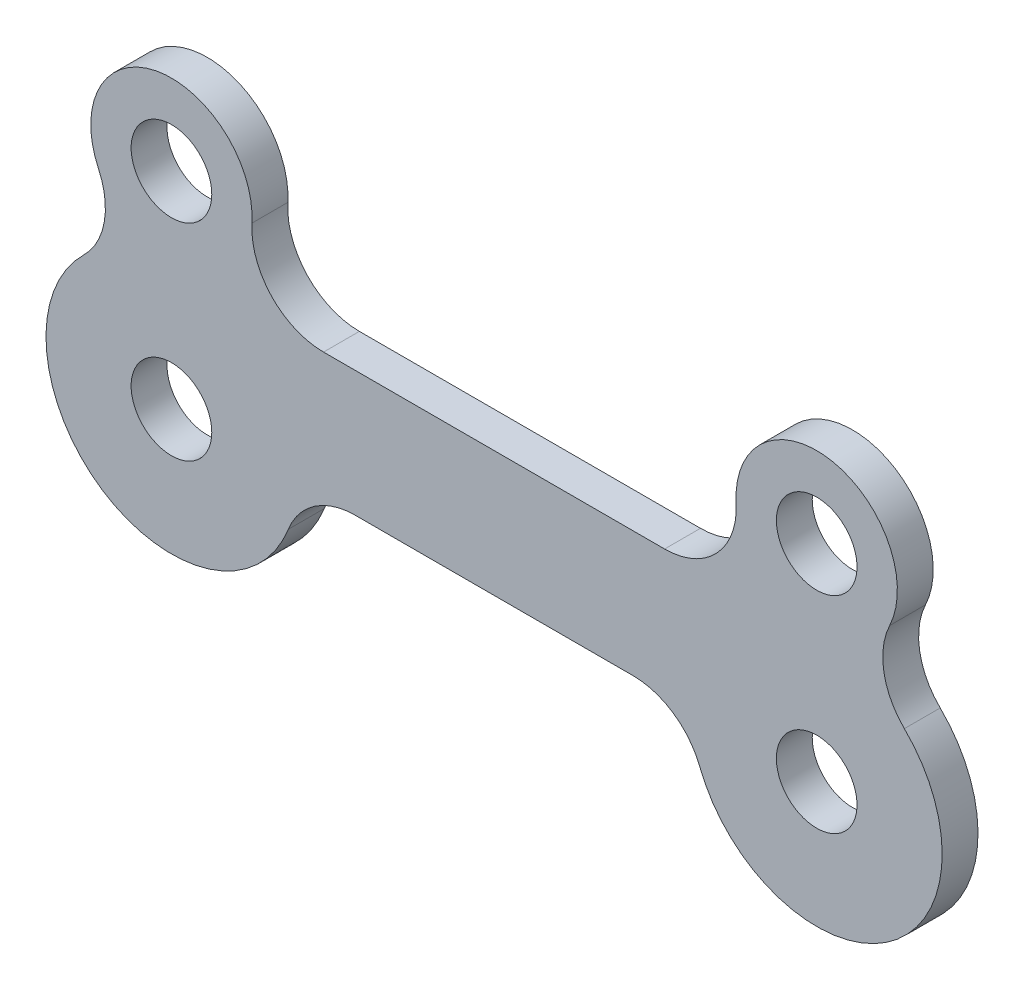
ISO-10303-21;
HEADER;
FILE_DESCRIPTION(('STEP AP214'),'2;1');
FILE_NAME('part.step','',(''),(''),'','','');
FILE_SCHEMA(('AUTOMOTIVE_DESIGN { 1 0 10303 214 1 1 1 1 }'));
ENDSEC;
DATA;
#1=APPLICATION_CONTEXT('core data for automotive mechanical design processes');
#2=APPLICATION_PROTOCOL_DEFINITION('international standard','automotive_design',2000,#1);
#3=PRODUCT_CONTEXT('',#1,'mechanical');
#4=PRODUCT('Part','Part','',(#3));
#5=PRODUCT_RELATED_PRODUCT_CATEGORY('part','',(#4));
#6=PRODUCT_DEFINITION_FORMATION('','',#4);
#7=PRODUCT_DEFINITION_CONTEXT('part definition',#1,'design');
#8=PRODUCT_DEFINITION('design','',#6,#7);
#9=PRODUCT_DEFINITION_SHAPE('','',#8);
#10=(LENGTH_UNIT() NAMED_UNIT(*) SI_UNIT(.MILLI.,.METRE.));
#11=(NAMED_UNIT(*) PLANE_ANGLE_UNIT() SI_UNIT($,.RADIAN.));
#12=(NAMED_UNIT(*) SI_UNIT($,.STERADIAN.) SOLID_ANGLE_UNIT());
#13=UNCERTAINTY_MEASURE_WITH_UNIT(LENGTH_MEASURE(1.E-05),#10,'distance_accuracy_value','');
#14=(GEOMETRIC_REPRESENTATION_CONTEXT(3) GLOBAL_UNCERTAINTY_ASSIGNED_CONTEXT((#13)) GLOBAL_UNIT_ASSIGNED_CONTEXT((#10,
#11,#12)) REPRESENTATION_CONTEXT('',''));
#15=CARTESIAN_POINT('',(0.,0.,0.));
#16=DIRECTION('',(0.,0.,1.));
#17=DIRECTION('',(1.,0.,0.));
#18=AXIS2_PLACEMENT_3D('',#15,#16,#17);
#19=CARTESIAN_POINT('',(-7.55230790919814,8.73125,1.5875));
#20=DIRECTION('',(0.,0.,-1.));
#21=DIRECTION('',(-1.,0.,0.));
#22=AXIS2_PLACEMENT_3D('',#19,#20,#21);
#23=CYLINDRICAL_SURFACE('',#22,3.175);
#24=CARTESIAN_POINT('',(-7.55230790919814,8.73125,0.));
#25=DIRECTION('',(0.,0.,1.));
#26=DIRECTION('',(1.,0.,0.));
#27=AXIS2_PLACEMENT_3D('',#24,#25,#26);
#28=CIRCLE('',#27,3.175);
#29=CARTESIAN_POINT('',(-10.7218100695755,8.91801470588235,0.));
#30=VERTEX_POINT('',#29);
#31=CARTESIAN_POINT('',(-7.55230790919814,5.55625,0.));
#32=VERTEX_POINT('',#31);
#33=EDGE_CURVE('E160',#30,#32,#28,.T.);
#34=ORIENTED_EDGE('',*,*,#33,.F.);
#35=DIRECTION('',(0.,0.,-1.));
#36=VECTOR('',#35,1.);
#37=CARTESIAN_POINT('',(-10.7218100695755,8.91801470588235,1.5875));
#38=LINE('',#37,#36);
#39=CARTESIAN_POINT('',(-10.7218100695755,8.91801470588235,1.5875));
#40=VERTEX_POINT('',#39);
#41=EDGE_CURVE('E228',#40,#30,#38,.T.);
#42=ORIENTED_EDGE('',*,*,#41,.F.);
#43=CARTESIAN_POINT('',(-7.55230790919814,8.73125,1.5875));
#44=DIRECTION('',(0.,0.,1.));
#45=DIRECTION('',(1.,0.,0.));
#46=AXIS2_PLACEMENT_3D('',#43,#44,#45);
#47=CIRCLE('',#46,3.175);
#48=CARTESIAN_POINT('',(-7.55230790919814,5.55625,1.5875));
#49=VERTEX_POINT('',#48);
#50=EDGE_CURVE('E172',#40,#49,#47,.T.);
#51=ORIENTED_EDGE('',*,*,#50,.T.);
#52=DIRECTION('',(0.,0.,-1.));
#53=VECTOR('',#52,1.);
#54=CARTESIAN_POINT('',(-7.55230790919814,5.55625,1.5875));
#55=LINE('',#54,#53);
#56=EDGE_CURVE('E136',#49,#32,#55,.T.);
#57=ORIENTED_EDGE('',*,*,#56,.T.);
#58=EDGE_LOOP('',(#34,#42,#51,#57));
#59=FACE_BOUND('',#58,.T.);
#60=ADVANCED_FACE('F41',(#59),#23,.F.);
#61=CARTESIAN_POINT('',(-14.2875,9.128125,1.5875));
#62=DIRECTION('',(0.,0.,-1.));
#63=DIRECTION('',(-1.,0.,0.));
#64=AXIS2_PLACEMENT_3D('',#61,#62,#63);
#65=CYLINDRICAL_SURFACE('',#64,3.571875);
#66=CARTESIAN_POINT('',(-14.2875,9.128125,0.));
#67=DIRECTION('',(0.,0.,1.));
#68=DIRECTION('',(1.,0.,0.));
#69=AXIS2_PLACEMENT_3D('',#66,#67,#68);
#70=CIRCLE('',#69,3.571875);
#71=CARTESIAN_POINT('',(-17.5171882486604,7.6025415601023,0.));
#72=VERTEX_POINT('',#71);
#73=EDGE_CURVE('E166',#30,#72,#70,.T.);
#74=ORIENTED_EDGE('',*,*,#73,.T.);
#75=DIRECTION('',(0.,0.,-1.));
#76=VECTOR('',#75,1.);
#77=CARTESIAN_POINT('',(-17.5171882486604,7.6025415601023,1.5875));
#78=LINE('',#77,#76);
#79=CARTESIAN_POINT('',(-17.5171882486604,7.6025415601023,1.5875));
#80=VERTEX_POINT('',#79);
#81=EDGE_CURVE('E225',#80,#72,#78,.T.);
#82=ORIENTED_EDGE('',*,*,#81,.F.);
#83=CARTESIAN_POINT('',(-14.2875,9.128125,1.5875));
#84=DIRECTION('',(0.,0.,1.));
#85=DIRECTION('',(1.,0.,0.));
#86=AXIS2_PLACEMENT_3D('',#83,#84,#85);
#87=CIRCLE('',#86,3.571875);
#88=EDGE_CURVE('E175',#40,#80,#87,.T.);
#89=ORIENTED_EDGE('',*,*,#88,.F.);
#90=ORIENTED_EDGE('',*,*,#41,.T.);
#91=EDGE_LOOP('',(#74,#82,#89,#90));
#92=FACE_BOUND('',#91,.T.);
#93=ADVANCED_FACE('F302',(#92),#65,.T.);
#94=CARTESIAN_POINT('',(-20.3880222474696,6.24646739130435,1.5875));
#95=DIRECTION('',(0.,0.,-1.));
#96=DIRECTION('',(-1.,0.,0.));
#97=AXIS2_PLACEMENT_3D('',#94,#95,#96);
#98=CYLINDRICAL_SURFACE('',#97,3.175);
#99=CARTESIAN_POINT('',(-20.3880222474696,6.24646739130435,0.));
#100=DIRECTION('',(0.,0.,1.));
#101=DIRECTION('',(1.,0.,0.));
#102=AXIS2_PLACEMENT_3D('',#99,#100,#101);
#103=CIRCLE('',#102,3.175);
#104=CARTESIAN_POINT('',(-18.169650521117,3.97502470355731,0.));
#105=VERTEX_POINT('',#104);
#106=EDGE_CURVE('E199',#105,#72,#103,.T.);
#107=ORIENTED_EDGE('',*,*,#106,.F.);
#108=DIRECTION('',(0.,0.,-1.));
#109=VECTOR('',#108,1.);
#110=CARTESIAN_POINT('',(-18.169650521117,3.97502470355731,1.5875));
#111=LINE('',#110,#109);
#112=CARTESIAN_POINT('',(-18.169650521117,3.97502470355731,1.5875));
#113=VERTEX_POINT('',#112);
#114=EDGE_CURVE('E222',#113,#105,#111,.T.);
#115=ORIENTED_EDGE('',*,*,#114,.F.);
#116=CARTESIAN_POINT('',(-20.3880222474696,6.24646739130435,1.5875));
#117=DIRECTION('',(0.,0.,1.));
#118=DIRECTION('',(1.,0.,0.));
#119=AXIS2_PLACEMENT_3D('',#116,#117,#118);
#120=CIRCLE('',#119,3.175);
#121=EDGE_CURVE('E179',#113,#80,#120,.T.);
#122=ORIENTED_EDGE('',*,*,#121,.T.);
#123=ORIENTED_EDGE('',*,*,#81,.T.);
#124=EDGE_LOOP('',(#107,#115,#122,#123));
#125=FACE_BOUND('',#124,.T.);
#126=ADVANCED_FACE('F305',(#125),#98,.F.);
#127=CARTESIAN_POINT('',(-14.2875,0.,1.5875));
#128=DIRECTION('',(0.,0.,-1.));
#129=DIRECTION('',(-1.,0.,0.));
#130=AXIS2_PLACEMENT_3D('',#127,#128,#129);
#131=CYLINDRICAL_SURFACE('',#130,5.55625);
#132=CARTESIAN_POINT('',(-14.2875,0.,0.));
#133=DIRECTION('',(0.,0.,1.));
#134=DIRECTION('',(1.,0.,0.));
#135=AXIS2_PLACEMENT_3D('',#132,#133,#134);
#136=CIRCLE('',#135,5.55625);
#137=CARTESIAN_POINT('',(-9.111625436967,-2.02045454545455,0.));
#138=VERTEX_POINT('',#137);
#139=EDGE_CURVE('E203',#105,#138,#136,.T.);
#140=ORIENTED_EDGE('',*,*,#139,.T.);
#141=DIRECTION('',(0.,0.,-1.));
#142=VECTOR('',#141,1.);
#143=CARTESIAN_POINT('',(-9.111625436967,-2.02045454545455,1.5875));
#144=LINE('',#143,#142);
#145=CARTESIAN_POINT('',(-9.111625436967,-2.02045454545455,1.5875));
#146=VERTEX_POINT('',#145);
#147=EDGE_CURVE('E235',#138,#146,#144,.F.);
#148=ORIENTED_EDGE('',*,*,#147,.T.);
#149=CARTESIAN_POINT('',(-14.2875,0.,1.5875));
#150=DIRECTION('',(0.,0.,1.));
#151=DIRECTION('',(1.,0.,0.));
#152=AXIS2_PLACEMENT_3D('',#149,#150,#151);
#153=CIRCLE('',#152,5.55625);
#154=EDGE_CURVE('E183',#113,#146,#153,.T.);
#155=ORIENTED_EDGE('',*,*,#154,.F.);
#156=ORIENTED_EDGE('',*,*,#114,.T.);
#157=EDGE_LOOP('',(#140,#148,#155,#156));
#158=FACE_BOUND('',#157,.T.);
#159=ADVANCED_FACE('F309',(#158),#131,.T.);
#160=CARTESIAN_POINT('',(0.,0.,1.5875));
#161=DIRECTION('',(0.,-1.,0.));
#162=DIRECTION('',(0.,0.,-1.));
#163=AXIS2_PLACEMENT_3D('',#160,#161,#162);
#164=PLANE('',#163);
#165=DIRECTION('',(-1.,0.,0.));
#166=VECTOR('',#165,1.);
#167=CARTESIAN_POINT('',(0.,0.,0.));
#168=LINE('',#167,#166);
#169=CARTESIAN_POINT('',(6.15398282951957,0.,0.));
#170=VERTEX_POINT('',#169);
#171=CARTESIAN_POINT('',(-6.15398282951957,0.,0.));
#172=VERTEX_POINT('',#171);
#173=EDGE_CURVE('E207',#170,#172,#168,.T.);
#174=ORIENTED_EDGE('',*,*,#173,.F.);
#175=DIRECTION('',(0.,0.,1.));
#176=VECTOR('',#175,1.);
#177=CARTESIAN_POINT('',(6.15398282951957,0.,1.5875));
#178=LINE('',#177,#176);
#179=CARTESIAN_POINT('',(6.15398282951957,0.,1.5875));
#180=VERTEX_POINT('',#179);
#181=EDGE_CURVE('E63',#170,#180,#178,.T.);
#182=ORIENTED_EDGE('',*,*,#181,.T.);
#183=DIRECTION('',(-1.,0.,0.));
#184=VECTOR('',#183,1.);
#185=CARTESIAN_POINT('',(0.,0.,1.5875));
#186=LINE('',#185,#184);
#187=CARTESIAN_POINT('',(-6.15398282951957,0.,1.5875));
#188=VERTEX_POINT('',#187);
#189=EDGE_CURVE('E142',#180,#188,#186,.T.);
#190=ORIENTED_EDGE('',*,*,#189,.T.);
#191=DIRECTION('',(0.,0.,-1.));
#192=VECTOR('',#191,1.);
#193=CARTESIAN_POINT('',(-6.15398282951957,0.,1.5875));
#194=LINE('',#193,#192);
#195=EDGE_CURVE('E231',#188,#172,#194,.T.);
#196=ORIENTED_EDGE('',*,*,#195,.T.);
#197=EDGE_LOOP('',(#174,#182,#190,#196));
#198=FACE_BOUND('',#197,.T.);
#199=ADVANCED_FACE('F316',(#198),#164,.T.);
#200=CARTESIAN_POINT('',(-14.2875,0.,1.5875));
#201=DIRECTION('',(0.,0.,-1.));
#202=DIRECTION('',(-1.,0.,0.));
#203=AXIS2_PLACEMENT_3D('',#200,#201,#202);
#204=CYLINDRICAL_SURFACE('',#203,1.7859375);
#205=CARTESIAN_POINT('',(-14.2875,0.,1.5875));
#206=DIRECTION('',(0.,0.,1.));
#207=DIRECTION('',(1.,0.,0.));
#208=AXIS2_PLACEMENT_3D('',#205,#206,#207);
#209=CIRCLE('',#208,1.7859375);
#210=CARTESIAN_POINT('',(-12.5015625,0.,1.5875));
#211=VERTEX_POINT('',#210);
#212=EDGE_CURVE('E141',#211,#211,#209,.T.);
#213=ORIENTED_EDGE('',*,*,#212,.T.);
#214=EDGE_LOOP('',(#213));
#215=FACE_BOUND('',#214,.T.);
#216=CARTESIAN_POINT('',(-14.2875,0.,0.));
#217=DIRECTION('',(0.,0.,1.));
#218=DIRECTION('',(1.,0.,0.));
#219=AXIS2_PLACEMENT_3D('',#216,#217,#218);
#220=CIRCLE('',#219,1.7859375);
#221=CARTESIAN_POINT('',(-12.5015625,0.,0.));
#222=VERTEX_POINT('',#221);
#223=EDGE_CURVE('E213',#222,#222,#220,.T.);
#224=ORIENTED_EDGE('',*,*,#223,.F.);
#225=EDGE_LOOP('',(#224));
#226=FACE_BOUND('',#225,.T.);
#227=ADVANCED_FACE('F347',(#215,#226),#204,.F.);
#228=CARTESIAN_POINT('',(0.,5.55625,1.5875));
#229=DIRECTION('',(0.,1.,0.));
#230=DIRECTION('',(0.,0.,1.));
#231=AXIS2_PLACEMENT_3D('',#228,#229,#230);
#232=PLANE('',#231);
#233=DIRECTION('',(1.,0.,0.));
#234=VECTOR('',#233,1.);
#235=CARTESIAN_POINT('',(0.,5.55625,0.));
#236=LINE('',#235,#234);
#237=CARTESIAN_POINT('',(7.55230790919814,5.55625,0.));
#238=VERTEX_POINT('',#237);
#239=EDGE_CURVE('E210',#32,#238,#236,.T.);
#240=ORIENTED_EDGE('',*,*,#239,.F.);
#241=ORIENTED_EDGE('',*,*,#56,.F.);
#242=DIRECTION('',(1.,0.,0.));
#243=VECTOR('',#242,1.);
#244=CARTESIAN_POINT('',(0.,5.55625,1.5875));
#245=LINE('',#244,#243);
#246=CARTESIAN_POINT('',(7.55230790919814,5.55625,1.5875));
#247=VERTEX_POINT('',#246);
#248=EDGE_CURVE('E129',#49,#247,#245,.T.);
#249=ORIENTED_EDGE('',*,*,#248,.T.);
#250=DIRECTION('',(0.,0.,-1.));
#251=VECTOR('',#250,1.);
#252=CARTESIAN_POINT('',(7.55230790919814,5.55625,1.5875));
#253=LINE('',#252,#251);
#254=EDGE_CURVE('E134',#247,#238,#253,.T.);
#255=ORIENTED_EDGE('',*,*,#254,.T.);
#256=EDGE_LOOP('',(#240,#241,#249,#255));
#257=FACE_BOUND('',#256,.T.);
#258=ADVANCED_FACE('F132',(#257),#232,.T.);
#259=CARTESIAN_POINT('',(-14.2875,9.128125,1.5875));
#260=DIRECTION('',(0.,0.,-1.));
#261=DIRECTION('',(-1.,0.,0.));
#262=AXIS2_PLACEMENT_3D('',#259,#260,#261);
#263=CYLINDRICAL_SURFACE('',#262,1.7859375);
#264=CARTESIAN_POINT('',(-14.2875,9.128125,1.5875));
#265=DIRECTION('',(0.,0.,1.));
#266=DIRECTION('',(1.,0.,0.));
#267=AXIS2_PLACEMENT_3D('',#264,#265,#266);
#268=CIRCLE('',#267,1.7859375);
#269=CARTESIAN_POINT('',(-12.5015625,9.128125,1.5875));
#270=VERTEX_POINT('',#269);
#271=EDGE_CURVE('E192',#270,#270,#268,.T.);
#272=ORIENTED_EDGE('',*,*,#271,.T.);
#273=EDGE_LOOP('',(#272));
#274=FACE_BOUND('',#273,.T.);
#275=CARTESIAN_POINT('',(-14.2875,9.128125,0.));
#276=DIRECTION('',(0.,0.,1.));
#277=DIRECTION('',(1.,0.,0.));
#278=AXIS2_PLACEMENT_3D('',#275,#276,#277);
#279=CIRCLE('',#278,1.7859375);
#280=CARTESIAN_POINT('',(-12.5015625,9.128125,0.));
#281=VERTEX_POINT('',#280);
#282=EDGE_CURVE('E176',#281,#281,#279,.T.);
#283=ORIENTED_EDGE('',*,*,#282,.F.);
#284=EDGE_LOOP('',(#283));
#285=FACE_BOUND('',#284,.T.);
#286=ADVANCED_FACE('F341',(#274,#285),#263,.F.);
#287=CARTESIAN_POINT('',(0.,0.,1.5875));
#288=DIRECTION('',(0.,0.,1.));
#289=DIRECTION('',(1.,0.,0.));
#290=AXIS2_PLACEMENT_3D('',#287,#288,#289);
#291=PLANE('',#290);
#292=ORIENTED_EDGE('',*,*,#50,.F.);
#293=ORIENTED_EDGE('',*,*,#88,.T.);
#294=ORIENTED_EDGE('',*,*,#121,.F.);
#295=ORIENTED_EDGE('',*,*,#154,.T.);
#296=CARTESIAN_POINT('',(-6.15398282951957,-3.175,1.5875));
#297=DIRECTION('',(0.,0.,1.));
#298=DIRECTION('',(1.,0.,0.));
#299=AXIS2_PLACEMENT_3D('',#296,#297,#298);
#300=CIRCLE('',#299,3.175);
#301=EDGE_CURVE('E241',#146,#188,#300,.F.);
#302=ORIENTED_EDGE('',*,*,#301,.T.);
#303=ORIENTED_EDGE('',*,*,#189,.F.);
#304=CARTESIAN_POINT('',(6.15398282951957,-3.175,1.5875));
#305=DIRECTION('',(0.,0.,1.));
#306=DIRECTION('',(1.,0.,0.));
#307=AXIS2_PLACEMENT_3D('',#304,#305,#306);
#308=CIRCLE('',#307,3.175);
#309=CARTESIAN_POINT('',(9.111625436967,-2.02045454545455,1.5875));
#310=VERTEX_POINT('',#309);
#311=EDGE_CURVE('E11',#180,#310,#308,.F.);
#312=ORIENTED_EDGE('',*,*,#311,.T.);
#313=CARTESIAN_POINT('',(14.2875,0.,1.5875));
#314=DIRECTION('',(0.,0.,-1.));
#315=DIRECTION('',(-1.,0.,0.));
#316=AXIS2_PLACEMENT_3D('',#313,#314,#315);
#317=CIRCLE('',#316,5.55625);
#318=CARTESIAN_POINT('',(18.169650521117,3.97502470355731,1.5875));
#319=VERTEX_POINT('',#318);
#320=EDGE_CURVE('E153',#319,#310,#317,.T.);
#321=ORIENTED_EDGE('',*,*,#320,.F.);
#322=CARTESIAN_POINT('',(20.3880222474696,6.24646739130435,1.5875));
#323=DIRECTION('',(0.,0.,-1.));
#324=DIRECTION('',(-1.,0.,0.));
#325=AXIS2_PLACEMENT_3D('',#322,#323,#324);
#326=CIRCLE('',#325,3.175);
#327=CARTESIAN_POINT('',(17.5171882486604,7.6025415601023,1.5875));
#328=VERTEX_POINT('',#327);
#329=EDGE_CURVE('E461',#319,#328,#326,.T.);
#330=ORIENTED_EDGE('',*,*,#329,.T.);
#331=CARTESIAN_POINT('',(14.2875,9.128125,1.5875));
#332=DIRECTION('',(0.,0.,-1.));
#333=DIRECTION('',(-1.,0.,0.));
#334=AXIS2_PLACEMENT_3D('',#331,#332,#333);
#335=CIRCLE('',#334,3.571875);
#336=CARTESIAN_POINT('',(10.7218100695755,8.91801470588235,1.5875));
#337=VERTEX_POINT('',#336);
#338=EDGE_CURVE('E150',#337,#328,#335,.T.);
#339=ORIENTED_EDGE('',*,*,#338,.F.);
#340=CARTESIAN_POINT('',(7.55230790919814,8.73125,1.5875));
#341=DIRECTION('',(0.,0.,-1.));
#342=DIRECTION('',(-1.,0.,0.));
#343=AXIS2_PLACEMENT_3D('',#340,#341,#342);
#344=CIRCLE('',#343,3.175);
#345=EDGE_CURVE('E146',#337,#247,#344,.T.);
#346=ORIENTED_EDGE('',*,*,#345,.T.);
#347=ORIENTED_EDGE('',*,*,#248,.F.);
#348=EDGE_LOOP('',(#292,#293,#294,#295,#302,#303,#312,#321,#330,#339,#346,#347));
#349=FACE_BOUND('',#348,.T.);
#350=ORIENTED_EDGE('',*,*,#212,.F.);
#351=EDGE_LOOP('',(#350));
#352=FACE_BOUND('',#351,.T.);
#353=ORIENTED_EDGE('',*,*,#271,.F.);
#354=EDGE_LOOP('',(#353));
#355=FACE_BOUND('',#354,.T.);
#356=CARTESIAN_POINT('',(14.2875,0.,1.5875));
#357=DIRECTION('',(0.,0.,-1.));
#358=DIRECTION('',(-1.,0.,0.));
#359=AXIS2_PLACEMENT_3D('',#356,#357,#358);
#360=CIRCLE('',#359,1.7859375);
#361=CARTESIAN_POINT('',(12.5015625,0.,1.5875));
#362=VERTEX_POINT('',#361);
#363=EDGE_CURVE('E449',#362,#362,#360,.T.);
#364=ORIENTED_EDGE('',*,*,#363,.T.);
#365=EDGE_LOOP('',(#364));
#366=FACE_BOUND('',#365,.T.);
#367=CARTESIAN_POINT('',(14.2875,9.128125,1.5875));
#368=DIRECTION('',(0.,0.,-1.));
#369=DIRECTION('',(-1.,0.,0.));
#370=AXIS2_PLACEMENT_3D('',#367,#368,#369);
#371=CIRCLE('',#370,1.7859375);
#372=CARTESIAN_POINT('',(12.5015625,9.128125,1.5875));
#373=VERTEX_POINT('',#372);
#374=EDGE_CURVE('E286',#373,#373,#371,.T.);
#375=ORIENTED_EDGE('',*,*,#374,.T.);
#376=EDGE_LOOP('',(#375));
#377=FACE_BOUND('',#376,.T.);
#378=ADVANCED_FACE('F147',(#349,#352,#355,#366,#377),#291,.T.);
#379=CARTESIAN_POINT('',(0.,0.,0.));
#380=DIRECTION('',(0.,0.,1.));
#381=DIRECTION('',(1.,0.,0.));
#382=AXIS2_PLACEMENT_3D('',#379,#380,#381);
#383=PLANE('',#382);
#384=ORIENTED_EDGE('',*,*,#33,.T.);
#385=ORIENTED_EDGE('',*,*,#239,.T.);
#386=CARTESIAN_POINT('',(7.55230790919814,8.73125,0.));
#387=DIRECTION('',(0.,0.,-1.));
#388=DIRECTION('',(-1.,0.,0.));
#389=AXIS2_PLACEMENT_3D('',#386,#387,#388);
#390=CIRCLE('',#389,3.175);
#391=CARTESIAN_POINT('',(10.7218100695755,8.91801470588235,0.));
#392=VERTEX_POINT('',#391);
#393=EDGE_CURVE('E158',#392,#238,#390,.T.);
#394=ORIENTED_EDGE('',*,*,#393,.F.);
#395=CARTESIAN_POINT('',(14.2875,9.128125,0.));
#396=DIRECTION('',(0.,0.,-1.));
#397=DIRECTION('',(-1.,0.,0.));
#398=AXIS2_PLACEMENT_3D('',#395,#396,#397);
#399=CIRCLE('',#398,3.571875);
#400=CARTESIAN_POINT('',(17.5171882486604,7.6025415601023,0.));
#401=VERTEX_POINT('',#400);
#402=EDGE_CURVE('E270',#392,#401,#399,.T.);
#403=ORIENTED_EDGE('',*,*,#402,.T.);
#404=CARTESIAN_POINT('',(20.3880222474696,6.24646739130435,0.));
#405=DIRECTION('',(0.,0.,-1.));
#406=DIRECTION('',(-1.,0.,0.));
#407=AXIS2_PLACEMENT_3D('',#404,#405,#406);
#408=CIRCLE('',#407,3.175);
#409=CARTESIAN_POINT('',(18.169650521117,3.97502470355731,0.));
#410=VERTEX_POINT('',#409);
#411=EDGE_CURVE('E265',#410,#401,#408,.T.);
#412=ORIENTED_EDGE('',*,*,#411,.F.);
#413=CARTESIAN_POINT('',(14.2875,0.,0.));
#414=DIRECTION('',(0.,0.,-1.));
#415=DIRECTION('',(-1.,0.,0.));
#416=AXIS2_PLACEMENT_3D('',#413,#414,#415);
#417=CIRCLE('',#416,5.55625);
#418=CARTESIAN_POINT('',(9.111625436967,-2.02045454545455,0.));
#419=VERTEX_POINT('',#418);
#420=EDGE_CURVE('E256',#410,#419,#417,.T.);
#421=ORIENTED_EDGE('',*,*,#420,.T.);
#422=CARTESIAN_POINT('',(6.15398282951957,-3.175,0.));
#423=DIRECTION('',(0.,0.,1.));
#424=DIRECTION('',(1.,0.,0.));
#425=AXIS2_PLACEMENT_3D('',#422,#423,#424);
#426=CIRCLE('',#425,3.175);
#427=EDGE_CURVE('E50',#419,#170,#426,.T.);
#428=ORIENTED_EDGE('',*,*,#427,.T.);
#429=ORIENTED_EDGE('',*,*,#173,.T.);
#430=CARTESIAN_POINT('',(-6.15398282951957,-3.175,0.));
#431=DIRECTION('',(0.,0.,1.));
#432=DIRECTION('',(1.,0.,0.));
#433=AXIS2_PLACEMENT_3D('',#430,#431,#432);
#434=CIRCLE('',#433,3.175);
#435=EDGE_CURVE('E238',#172,#138,#434,.T.);
#436=ORIENTED_EDGE('',*,*,#435,.T.);
#437=ORIENTED_EDGE('',*,*,#139,.F.);
#438=ORIENTED_EDGE('',*,*,#106,.T.);
#439=ORIENTED_EDGE('',*,*,#73,.F.);
#440=EDGE_LOOP('',(#384,#385,#394,#403,#412,#421,#428,#429,#436,#437,#438,#439));
#441=FACE_BOUND('',#440,.T.);
#442=ORIENTED_EDGE('',*,*,#223,.T.);
#443=EDGE_LOOP('',(#442));
#444=FACE_BOUND('',#443,.T.);
#445=ORIENTED_EDGE('',*,*,#282,.T.);
#446=EDGE_LOOP('',(#445));
#447=FACE_BOUND('',#446,.T.);
#448=CARTESIAN_POINT('',(14.2875,0.,0.));
#449=DIRECTION('',(0.,0.,-1.));
#450=DIRECTION('',(-1.,0.,0.));
#451=AXIS2_PLACEMENT_3D('',#448,#449,#450);
#452=CIRCLE('',#451,1.7859375);
#453=CARTESIAN_POINT('',(12.5015625,0.,0.));
#454=VERTEX_POINT('',#453);
#455=EDGE_CURVE('E277',#454,#454,#452,.T.);
#456=ORIENTED_EDGE('',*,*,#455,.F.);
#457=EDGE_LOOP('',(#456));
#458=FACE_BOUND('',#457,.T.);
#459=CARTESIAN_POINT('',(14.2875,9.128125,0.));
#460=DIRECTION('',(0.,0.,-1.));
#461=DIRECTION('',(-1.,0.,0.));
#462=AXIS2_PLACEMENT_3D('',#459,#460,#461);
#463=CIRCLE('',#462,1.7859375);
#464=CARTESIAN_POINT('',(12.5015625,9.128125,0.));
#465=VERTEX_POINT('',#464);
#466=EDGE_CURVE('E154',#465,#465,#463,.T.);
#467=ORIENTED_EDGE('',*,*,#466,.F.);
#468=EDGE_LOOP('',(#467));
#469=FACE_BOUND('',#468,.T.);
#470=ADVANCED_FACE('F261',(#441,#444,#447,#458,#469),#383,.F.);
#471=CARTESIAN_POINT('',(-6.15398282951957,-3.175,1.5875));
#472=DIRECTION('',(0.,0.,-1.));
#473=DIRECTION('',(-1.,0.,0.));
#474=AXIS2_PLACEMENT_3D('',#471,#472,#473);
#475=CYLINDRICAL_SURFACE('',#474,3.175);
#476=ORIENTED_EDGE('',*,*,#301,.F.);
#477=ORIENTED_EDGE('',*,*,#147,.F.);
#478=ORIENTED_EDGE('',*,*,#435,.F.);
#479=ORIENTED_EDGE('',*,*,#195,.F.);
#480=EDGE_LOOP('',(#476,#477,#478,#479));
#481=FACE_BOUND('',#480,.T.);
#482=ADVANCED_FACE('F314',(#481),#475,.F.);
#483=CARTESIAN_POINT('',(7.55230790919814,8.73125,1.5875));
#484=DIRECTION('',(0.,0.,-1.));
#485=DIRECTION('',(-1.,0.,0.));
#486=AXIS2_PLACEMENT_3D('',#483,#484,#485);
#487=CYLINDRICAL_SURFACE('',#486,3.175);
#488=ORIENTED_EDGE('',*,*,#393,.T.);
#489=ORIENTED_EDGE('',*,*,#254,.F.);
#490=ORIENTED_EDGE('',*,*,#345,.F.);
#491=DIRECTION('',(0.,0.,-1.));
#492=VECTOR('',#491,1.);
#493=CARTESIAN_POINT('',(10.7218100695755,8.91801470588235,1.5875));
#494=LINE('',#493,#492);
#495=EDGE_CURVE('E284',#337,#392,#494,.T.);
#496=ORIENTED_EDGE('',*,*,#495,.T.);
#497=EDGE_LOOP('',(#488,#489,#490,#496));
#498=FACE_BOUND('',#497,.T.);
#499=ADVANCED_FACE('F156',(#498),#487,.F.);
#500=CARTESIAN_POINT('',(14.2875,0.,1.5875));
#501=DIRECTION('',(0.,0.,-1.));
#502=DIRECTION('',(-1.,0.,0.));
#503=AXIS2_PLACEMENT_3D('',#500,#501,#502);
#504=CYLINDRICAL_SURFACE('',#503,5.55625);
#505=ORIENTED_EDGE('',*,*,#320,.T.);
#506=DIRECTION('',(0.,0.,-1.));
#507=VECTOR('',#506,1.);
#508=CARTESIAN_POINT('',(9.111625436967,-2.02045454545455,1.5875));
#509=LINE('',#508,#507);
#510=EDGE_CURVE('E245',#310,#419,#509,.T.);
#511=ORIENTED_EDGE('',*,*,#510,.T.);
#512=ORIENTED_EDGE('',*,*,#420,.F.);
#513=DIRECTION('',(0.,0.,-1.));
#514=VECTOR('',#513,1.);
#515=CARTESIAN_POINT('',(18.169650521117,3.97502470355731,1.5875));
#516=LINE('',#515,#514);
#517=EDGE_CURVE('E161',#319,#410,#516,.T.);
#518=ORIENTED_EDGE('',*,*,#517,.F.);
#519=EDGE_LOOP('',(#505,#511,#512,#518));
#520=FACE_BOUND('',#519,.T.);
#521=ADVANCED_FACE('F255',(#520),#504,.T.);
#522=CARTESIAN_POINT('',(20.3880222474696,6.24646739130435,1.5875));
#523=DIRECTION('',(0.,0.,-1.));
#524=DIRECTION('',(-1.,0.,0.));
#525=AXIS2_PLACEMENT_3D('',#522,#523,#524);
#526=CYLINDRICAL_SURFACE('',#525,3.175);
#527=ORIENTED_EDGE('',*,*,#411,.T.);
#528=DIRECTION('',(0.,0.,-1.));
#529=VECTOR('',#528,1.);
#530=CARTESIAN_POINT('',(17.5171882486604,7.6025415601023,1.5875));
#531=LINE('',#530,#529);
#532=EDGE_CURVE('E168',#328,#401,#531,.T.);
#533=ORIENTED_EDGE('',*,*,#532,.F.);
#534=ORIENTED_EDGE('',*,*,#329,.F.);
#535=ORIENTED_EDGE('',*,*,#517,.T.);
#536=EDGE_LOOP('',(#527,#533,#534,#535));
#537=FACE_BOUND('',#536,.T.);
#538=ADVANCED_FACE('F294',(#537),#526,.F.);
#539=CARTESIAN_POINT('',(14.2875,0.,1.5875));
#540=DIRECTION('',(0.,0.,-1.));
#541=DIRECTION('',(-1.,0.,0.));
#542=AXIS2_PLACEMENT_3D('',#539,#540,#541);
#543=CYLINDRICAL_SURFACE('',#542,1.7859375);
#544=ORIENTED_EDGE('',*,*,#363,.F.);
#545=EDGE_LOOP('',(#544));
#546=FACE_BOUND('',#545,.T.);
#547=ORIENTED_EDGE('',*,*,#455,.T.);
#548=EDGE_LOOP('',(#547));
#549=FACE_BOUND('',#548,.T.);
#550=ADVANCED_FACE('F415',(#546,#549),#543,.F.);
#551=CARTESIAN_POINT('',(14.2875,9.128125,1.5875));
#552=DIRECTION('',(0.,0.,-1.));
#553=DIRECTION('',(-1.,0.,0.));
#554=AXIS2_PLACEMENT_3D('',#551,#552,#553);
#555=CYLINDRICAL_SURFACE('',#554,3.571875);
#556=ORIENTED_EDGE('',*,*,#402,.F.);
#557=ORIENTED_EDGE('',*,*,#495,.F.);
#558=ORIENTED_EDGE('',*,*,#338,.T.);
#559=ORIENTED_EDGE('',*,*,#532,.T.);
#560=EDGE_LOOP('',(#556,#557,#558,#559));
#561=FACE_BOUND('',#560,.T.);
#562=ADVANCED_FACE('F291',(#561),#555,.T.);
#563=CARTESIAN_POINT('',(14.2875,9.128125,1.5875));
#564=DIRECTION('',(0.,0.,-1.));
#565=DIRECTION('',(-1.,0.,0.));
#566=AXIS2_PLACEMENT_3D('',#563,#564,#565);
#567=CYLINDRICAL_SURFACE('',#566,1.7859375);
#568=ORIENTED_EDGE('',*,*,#374,.F.);
#569=EDGE_LOOP('',(#568));
#570=FACE_BOUND('',#569,.T.);
#571=ORIENTED_EDGE('',*,*,#466,.T.);
#572=EDGE_LOOP('',(#571));
#573=FACE_BOUND('',#572,.T.);
#574=ADVANCED_FACE('F318',(#570,#573),#567,.F.);
#575=CARTESIAN_POINT('',(6.15398282951957,-3.175,1.5875));
#576=DIRECTION('',(0.,0.,-1.));
#577=DIRECTION('',(-1.,0.,0.));
#578=AXIS2_PLACEMENT_3D('',#575,#576,#577);
#579=CYLINDRICAL_SURFACE('',#578,3.175);
#580=ORIENTED_EDGE('',*,*,#311,.F.);
#581=ORIENTED_EDGE('',*,*,#181,.F.);
#582=ORIENTED_EDGE('',*,*,#427,.F.);
#583=ORIENTED_EDGE('',*,*,#510,.F.);
#584=EDGE_LOOP('',(#580,#581,#582,#583));
#585=FACE_BOUND('',#584,.T.);
#586=ADVANCED_FACE('F43',(#585),#579,.F.);
#587=CLOSED_SHELL('',(#60,#93,#126,#159,#199,#227,#258,#286,#378,#470,#482,#499,#521,#538,#550,
#562,#574,#586));
#588=MANIFOLD_SOLID_BREP('B2',#587);
#589=ADVANCED_BREP_SHAPE_REPRESENTATION('',(#18,#588),#14);
#590=SHAPE_DEFINITION_REPRESENTATION(#9,#589);
ENDSEC;
END-ISO-10303-21;
